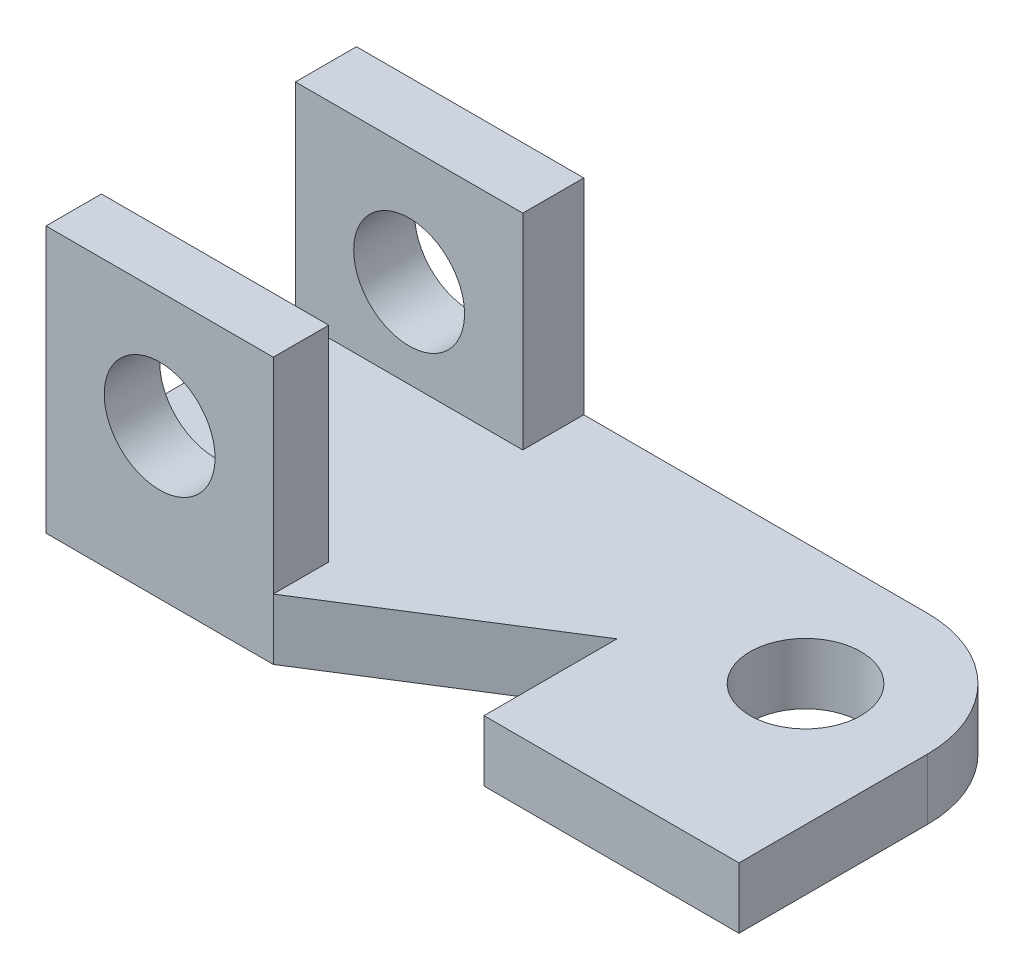
ISO-10303-21;
HEADER;
FILE_DESCRIPTION(('STEP AP214'),'2;1');
FILE_NAME('part.step','',(''),(''),'','','');
FILE_SCHEMA(('AUTOMOTIVE_DESIGN { 1 0 10303 214 1 1 1 1 }'));
ENDSEC;
DATA;
#1=APPLICATION_CONTEXT('core data for automotive mechanical design processes');
#2=APPLICATION_PROTOCOL_DEFINITION('international standard','automotive_design',2000,#1);
#3=PRODUCT_CONTEXT('',#1,'mechanical');
#4=PRODUCT('Part','Part','',(#3));
#5=PRODUCT_RELATED_PRODUCT_CATEGORY('part','',(#4));
#6=PRODUCT_DEFINITION_FORMATION('','',#4);
#7=PRODUCT_DEFINITION_CONTEXT('part definition',#1,'design');
#8=PRODUCT_DEFINITION('design','',#6,#7);
#9=PRODUCT_DEFINITION_SHAPE('','',#8);
#10=(LENGTH_UNIT() NAMED_UNIT(*) SI_UNIT(.MILLI.,.METRE.));
#11=(NAMED_UNIT(*) PLANE_ANGLE_UNIT() SI_UNIT($,.RADIAN.));
#12=(NAMED_UNIT(*) SI_UNIT($,.STERADIAN.) SOLID_ANGLE_UNIT());
#13=UNCERTAINTY_MEASURE_WITH_UNIT(LENGTH_MEASURE(1.E-05),#10,'distance_accuracy_value','');
#14=(GEOMETRIC_REPRESENTATION_CONTEXT(3) GLOBAL_UNCERTAINTY_ASSIGNED_CONTEXT((#13)) GLOBAL_UNIT_ASSIGNED_CONTEXT((#10,
#11,#12)) REPRESENTATION_CONTEXT('',''));
#15=CARTESIAN_POINT('',(0.,0.,0.));
#16=DIRECTION('',(0.,0.,1.));
#17=DIRECTION('',(1.,0.,0.));
#18=AXIS2_PLACEMENT_3D('',#15,#16,#17);
#19=CARTESIAN_POINT('',(-22.,11.,-34.));
#20=DIRECTION('',(0.,-1.,0.));
#21=DIRECTION('',(0.,0.,-1.));
#22=AXIS2_PLACEMENT_3D('',#19,#20,#21);
#23=PLANE('',#22);
#24=CARTESIAN_POINT('',(-22.,11.,-34.));
#25=DIRECTION('',(0.,1.,0.));
#26=DIRECTION('',(0.,0.,1.));
#27=AXIS2_PLACEMENT_3D('',#24,#25,#26);
#28=CIRCLE('',#27,10.);
#29=CARTESIAN_POINT('',(-22.,11.,-24.));
#30=VERTEX_POINT('',#29);
#31=EDGE_CURVE('E199',#30,#30,#28,.T.);
#32=ORIENTED_EDGE('',*,*,#31,.F.);
#33=EDGE_LOOP('',(#32));
#34=FACE_BOUND('',#33,.T.);
#35=DIRECTION('',(-1.,0.,0.));
#36=VECTOR('',#35,1.);
#37=CARTESIAN_POINT('',(-125.,11.,-56.));
#38=LINE('',#37,#36);
#39=CARTESIAN_POINT('',(-22.,11.,-56.));
#40=VERTEX_POINT('',#39);
#41=CARTESIAN_POINT('',(-84.,11.,-56.));
#42=VERTEX_POINT('',#41);
#43=EDGE_CURVE('E60',#40,#42,#38,.T.);
#44=ORIENTED_EDGE('',*,*,#43,.T.);
#45=DIRECTION('',(0.,0.,-1.));
#46=VECTOR('',#45,1.);
#47=CARTESIAN_POINT('',(-84.,11.,-45.));
#48=LINE('',#47,#46);
#49=CARTESIAN_POINT('',(-84.,11.,-45.));
#50=VERTEX_POINT('',#49);
#51=EDGE_CURVE('E55',#50,#42,#48,.T.);
#52=ORIENTED_EDGE('',*,*,#51,.F.);
#53=DIRECTION('',(-1.,0.,0.));
#54=VECTOR('',#53,1.);
#55=CARTESIAN_POINT('',(-84.,11.,-45.));
#56=LINE('',#55,#54);
#57=CARTESIAN_POINT('',(-125.,11.,-45.));
#58=VERTEX_POINT('',#57);
#59=EDGE_CURVE('E149',#50,#58,#56,.T.);
#60=ORIENTED_EDGE('',*,*,#59,.T.);
#61=DIRECTION('',(0.,0.,1.));
#62=VECTOR('',#61,1.);
#63=CARTESIAN_POINT('',(-125.,11.,0.));
#64=LINE('',#63,#62);
#65=CARTESIAN_POINT('',(-125.,11.,-9.99999999999999));
#66=VERTEX_POINT('',#65);
#67=EDGE_CURVE('E137',#58,#66,#64,.T.);
#68=ORIENTED_EDGE('',*,*,#67,.T.);
#69=DIRECTION('',(-1.,0.,0.));
#70=VECTOR('',#69,1.);
#71=CARTESIAN_POINT('',(-84.,11.,-10.));
#72=LINE('',#71,#70);
#73=CARTESIAN_POINT('',(-84.,11.,-10.));
#74=VERTEX_POINT('',#73);
#75=EDGE_CURVE('E181',#74,#66,#72,.T.);
#76=ORIENTED_EDGE('',*,*,#75,.F.);
#77=DIRECTION('',(0.,0.,-1.));
#78=VECTOR('',#77,1.);
#79=CARTESIAN_POINT('',(-84.,11.,0.));
#80=LINE('',#79,#78);
#81=CARTESIAN_POINT('',(-84.,11.,0.));
#82=VERTEX_POINT('',#81);
#83=EDGE_CURVE('E187',#82,#74,#80,.T.);
#84=ORIENTED_EDGE('',*,*,#83,.F.);
#85=DIRECTION('',(0.845488903030971,0.,-0.533992991387982));
#86=VECTOR('',#85,1.);
#87=CARTESIAN_POINT('',(-46.,11.,-24.));
#88=LINE('',#87,#86);
#89=CARTESIAN_POINT('',(-46.,11.,-24.));
#90=VERTEX_POINT('',#89);
#91=EDGE_CURVE('E147',#82,#90,#88,.T.);
#92=ORIENTED_EDGE('',*,*,#91,.T.);
#93=DIRECTION('',(0.,0.,1.));
#94=VECTOR('',#93,1.);
#95=CARTESIAN_POINT('',(-46.,11.,0.));
#96=LINE('',#95,#94);
#97=CARTESIAN_POINT('',(-46.,11.,0.));
#98=VERTEX_POINT('',#97);
#99=EDGE_CURVE('E213',#90,#98,#96,.T.);
#100=ORIENTED_EDGE('',*,*,#99,.T.);
#101=DIRECTION('',(1.,0.,0.));
#102=VECTOR('',#101,1.);
#103=CARTESIAN_POINT('',(0.,11.,0.));
#104=LINE('',#103,#102);
#105=CARTESIAN_POINT('',(0.,11.,0.));
#106=VERTEX_POINT('',#105);
#107=EDGE_CURVE('E215',#98,#106,#104,.T.);
#108=ORIENTED_EDGE('',*,*,#107,.T.);
#109=DIRECTION('',(0.,0.,-1.));
#110=VECTOR('',#109,1.);
#111=CARTESIAN_POINT('',(0.,11.,-34.));
#112=LINE('',#111,#110);
#113=CARTESIAN_POINT('',(0.,11.,-34.));
#114=VERTEX_POINT('',#113);
#115=EDGE_CURVE('E205',#106,#114,#112,.T.);
#116=ORIENTED_EDGE('',*,*,#115,.T.);
#117=CARTESIAN_POINT('',(-22.,11.,-34.));
#118=DIRECTION('',(0.,1.,0.));
#119=DIRECTION('',(0.,0.,-1.));
#120=AXIS2_PLACEMENT_3D('',#117,#118,#119);
#121=CIRCLE('',#120,22.);
#122=EDGE_CURVE('E208',#114,#40,#121,.T.);
#123=ORIENTED_EDGE('',*,*,#122,.T.);
#124=EDGE_LOOP('',(#44,#52,#60,#68,#76,#84,#92,#100,#108,#116,#123));
#125=FACE_BOUND('',#124,.T.);
#126=ADVANCED_FACE('F39',(#34,#125),#23,.F.);
#127=CARTESIAN_POINT('',(-22.,0.,-34.));
#128=DIRECTION('',(0.,-1.,0.));
#129=DIRECTION('',(0.,0.,-1.));
#130=AXIS2_PLACEMENT_3D('',#127,#128,#129);
#131=PLANE('',#130);
#132=DIRECTION('',(0.,0.,-1.));
#133=VECTOR('',#132,1.);
#134=CARTESIAN_POINT('',(0.,0.,-34.));
#135=LINE('',#134,#133);
#136=CARTESIAN_POINT('',(0.,0.,0.));
#137=VERTEX_POINT('',#136);
#138=CARTESIAN_POINT('',(0.,0.,-34.));
#139=VERTEX_POINT('',#138);
#140=EDGE_CURVE('E202',#137,#139,#135,.T.);
#141=ORIENTED_EDGE('',*,*,#140,.F.);
#142=DIRECTION('',(1.,0.,0.));
#143=VECTOR('',#142,1.);
#144=CARTESIAN_POINT('',(0.,0.,0.));
#145=LINE('',#144,#143);
#146=CARTESIAN_POINT('',(-46.,0.,0.));
#147=VERTEX_POINT('',#146);
#148=EDGE_CURVE('E209',#147,#137,#145,.T.);
#149=ORIENTED_EDGE('',*,*,#148,.F.);
#150=DIRECTION('',(0.,0.,1.));
#151=VECTOR('',#150,1.);
#152=CARTESIAN_POINT('',(-46.,0.,0.));
#153=LINE('',#152,#151);
#154=CARTESIAN_POINT('',(-46.,0.,-24.));
#155=VERTEX_POINT('',#154);
#156=EDGE_CURVE('E230',#155,#147,#153,.T.);
#157=ORIENTED_EDGE('',*,*,#156,.F.);
#158=DIRECTION('',(0.845488903030971,0.,-0.533992991387982));
#159=VECTOR('',#158,1.);
#160=CARTESIAN_POINT('',(-46.,0.,-24.));
#161=LINE('',#160,#159);
#162=CARTESIAN_POINT('',(-84.,0.,0.));
#163=VERTEX_POINT('',#162);
#164=EDGE_CURVE('E228',#163,#155,#161,.T.);
#165=ORIENTED_EDGE('',*,*,#164,.F.);
#166=DIRECTION('',(1.,0.,0.));
#167=VECTOR('',#166,1.);
#168=CARTESIAN_POINT('',(-84.,0.,0.));
#169=LINE('',#168,#167);
#170=CARTESIAN_POINT('',(-125.,0.,0.));
#171=VERTEX_POINT('',#170);
#172=EDGE_CURVE('E226',#171,#163,#169,.T.);
#173=ORIENTED_EDGE('',*,*,#172,.F.);
#174=DIRECTION('',(0.,0.,1.));
#175=VECTOR('',#174,1.);
#176=CARTESIAN_POINT('',(-125.,0.,0.));
#177=LINE('',#176,#175);
#178=CARTESIAN_POINT('',(-125.,0.,-56.));
#179=VERTEX_POINT('',#178);
#180=EDGE_CURVE('E224',#179,#171,#177,.T.);
#181=ORIENTED_EDGE('',*,*,#180,.F.);
#182=DIRECTION('',(-1.,0.,0.));
#183=VECTOR('',#182,1.);
#184=CARTESIAN_POINT('',(-125.,0.,-56.));
#185=LINE('',#184,#183);
#186=CARTESIAN_POINT('',(-22.,0.,-56.));
#187=VERTEX_POINT('',#186);
#188=EDGE_CURVE('E222',#187,#179,#185,.T.);
#189=ORIENTED_EDGE('',*,*,#188,.F.);
#190=CARTESIAN_POINT('',(-22.,0.,-34.));
#191=DIRECTION('',(0.,1.,0.));
#192=DIRECTION('',(0.,0.,-1.));
#193=AXIS2_PLACEMENT_3D('',#190,#191,#192);
#194=CIRCLE('',#193,22.);
#195=EDGE_CURVE('E220',#139,#187,#194,.T.);
#196=ORIENTED_EDGE('',*,*,#195,.F.);
#197=EDGE_LOOP('',(#141,#149,#157,#165,#173,#181,#189,#196));
#198=FACE_BOUND('',#197,.T.);
#199=CARTESIAN_POINT('',(-22.,0.,-34.));
#200=DIRECTION('',(0.,1.,0.));
#201=DIRECTION('',(0.,0.,1.));
#202=AXIS2_PLACEMENT_3D('',#199,#200,#201);
#203=CIRCLE('',#202,10.);
#204=CARTESIAN_POINT('',(-22.,0.,-24.));
#205=VERTEX_POINT('',#204);
#206=EDGE_CURVE('E198',#205,#205,#203,.T.);
#207=ORIENTED_EDGE('',*,*,#206,.T.);
#208=EDGE_LOOP('',(#207));
#209=FACE_BOUND('',#208,.T.);
#210=ADVANCED_FACE('F260',(#198,#209),#131,.T.);
#211=CARTESIAN_POINT('',(0.,11.,-34.));
#212=DIRECTION('',(-1.,0.,0.));
#213=DIRECTION('',(0.,0.,1.));
#214=AXIS2_PLACEMENT_3D('',#211,#212,#213);
#215=PLANE('',#214);
#216=ORIENTED_EDGE('',*,*,#140,.T.);
#217=DIRECTION('',(0.,-1.,0.));
#218=VECTOR('',#217,1.);
#219=CARTESIAN_POINT('',(0.,11.,-34.));
#220=LINE('',#219,#218);
#221=EDGE_CURVE('E11',#114,#139,#220,.T.);
#222=ORIENTED_EDGE('',*,*,#221,.F.);
#223=ORIENTED_EDGE('',*,*,#115,.F.);
#224=DIRECTION('',(0.,-1.,0.));
#225=VECTOR('',#224,1.);
#226=CARTESIAN_POINT('',(0.,11.,0.));
#227=LINE('',#226,#225);
#228=EDGE_CURVE('E217',#106,#137,#227,.T.);
#229=ORIENTED_EDGE('',*,*,#228,.T.);
#230=EDGE_LOOP('',(#216,#222,#223,#229));
#231=FACE_BOUND('',#230,.T.);
#232=ADVANCED_FACE('F41',(#231),#215,.F.);
#233=CARTESIAN_POINT('',(-22.,11.,-34.));
#234=DIRECTION('',(0.,-1.,0.));
#235=DIRECTION('',(0.,0.,-1.));
#236=AXIS2_PLACEMENT_3D('',#233,#234,#235);
#237=CYLINDRICAL_SURFACE('',#236,22.);
#238=ORIENTED_EDGE('',*,*,#195,.T.);
#239=DIRECTION('',(0.,-1.,0.));
#240=VECTOR('',#239,1.);
#241=CARTESIAN_POINT('',(-22.,11.,-56.));
#242=LINE('',#241,#240);
#243=EDGE_CURVE('E48',#40,#187,#242,.T.);
#244=ORIENTED_EDGE('',*,*,#243,.F.);
#245=ORIENTED_EDGE('',*,*,#122,.F.);
#246=ORIENTED_EDGE('',*,*,#221,.T.);
#247=EDGE_LOOP('',(#238,#244,#245,#246));
#248=FACE_BOUND('',#247,.T.);
#249=ADVANCED_FACE('F318',(#248),#237,.T.);
#250=CARTESIAN_POINT('',(-125.,11.,-56.));
#251=DIRECTION('',(0.,0.,1.));
#252=DIRECTION('',(1.,0.,0.));
#253=AXIS2_PLACEMENT_3D('',#250,#251,#252);
#254=PLANE('',#253);
#255=ORIENTED_EDGE('',*,*,#188,.T.);
#256=DIRECTION('',(0.,-1.,0.));
#257=VECTOR('',#256,1.);
#258=CARTESIAN_POINT('',(-125.,11.,-56.));
#259=LINE('',#258,#257);
#260=CARTESIAN_POINT('',(-125.,48.,-56.));
#261=VERTEX_POINT('',#260);
#262=EDGE_CURVE('E247',#261,#179,#259,.T.);
#263=ORIENTED_EDGE('',*,*,#262,.F.);
#264=DIRECTION('',(1.,0.,0.));
#265=VECTOR('',#264,1.);
#266=CARTESIAN_POINT('',(-125.,48.,-56.));
#267=LINE('',#266,#265);
#268=CARTESIAN_POINT('',(-84.,48.,-56.));
#269=VERTEX_POINT('',#268);
#270=EDGE_CURVE('E165',#261,#269,#267,.T.);
#271=ORIENTED_EDGE('',*,*,#270,.T.);
#272=DIRECTION('',(0.,-1.,0.));
#273=VECTOR('',#272,1.);
#274=CARTESIAN_POINT('',(-84.,48.,-56.));
#275=LINE('',#274,#273);
#276=EDGE_CURVE('E162',#269,#42,#275,.T.);
#277=ORIENTED_EDGE('',*,*,#276,.T.);
#278=ORIENTED_EDGE('',*,*,#43,.F.);
#279=ORIENTED_EDGE('',*,*,#243,.T.);
#280=EDGE_LOOP('',(#255,#263,#271,#277,#278,#279));
#281=FACE_BOUND('',#280,.T.);
#282=CARTESIAN_POINT('',(-104.5,27.,-56.));
#283=DIRECTION('',(0.,0.,-1.));
#284=DIRECTION('',(-1.,0.,0.));
#285=AXIS2_PLACEMENT_3D('',#282,#283,#284);
#286=CIRCLE('',#285,9.99999999999999);
#287=CARTESIAN_POINT('',(-114.5,27.,-56.));
#288=VERTEX_POINT('',#287);
#289=EDGE_CURVE('E474',#288,#288,#286,.T.);
#290=ORIENTED_EDGE('',*,*,#289,.F.);
#291=EDGE_LOOP('',(#290));
#292=FACE_BOUND('',#291,.T.);
#293=ADVANCED_FACE('F254',(#281,#292),#254,.F.);
#294=CARTESIAN_POINT('',(-125.,11.,0.));
#295=DIRECTION('',(1.,0.,0.));
#296=DIRECTION('',(0.,0.,-1.));
#297=AXIS2_PLACEMENT_3D('',#294,#295,#296);
#298=PLANE('',#297);
#299=ORIENTED_EDGE('',*,*,#180,.T.);
#300=DIRECTION('',(0.,-1.,0.));
#301=VECTOR('',#300,1.);
#302=CARTESIAN_POINT('',(-125.,11.,0.));
#303=LINE('',#302,#301);
#304=CARTESIAN_POINT('',(-125.,48.,0.));
#305=VERTEX_POINT('',#304);
#306=EDGE_CURVE('E244',#305,#171,#303,.T.);
#307=ORIENTED_EDGE('',*,*,#306,.F.);
#308=DIRECTION('',(0.,0.,1.));
#309=VECTOR('',#308,1.);
#310=CARTESIAN_POINT('',(-125.,48.,-9.99999999999999));
#311=LINE('',#310,#309);
#312=CARTESIAN_POINT('',(-125.,48.,-9.99999999999999));
#313=VERTEX_POINT('',#312);
#314=EDGE_CURVE('E177',#313,#305,#311,.T.);
#315=ORIENTED_EDGE('',*,*,#314,.F.);
#316=DIRECTION('',(0.,-1.,0.));
#317=VECTOR('',#316,1.);
#318=CARTESIAN_POINT('',(-125.,48.,-9.99999999999999));
#319=LINE('',#318,#317);
#320=EDGE_CURVE('E145',#313,#66,#319,.T.);
#321=ORIENTED_EDGE('',*,*,#320,.T.);
#322=ORIENTED_EDGE('',*,*,#67,.F.);
#323=DIRECTION('',(0.,1.,0.));
#324=VECTOR('',#323,1.);
#325=CARTESIAN_POINT('',(-125.,11.,-45.));
#326=LINE('',#325,#324);
#327=CARTESIAN_POINT('',(-125.,48.,-45.));
#328=VERTEX_POINT('',#327);
#329=EDGE_CURVE('E141',#58,#328,#326,.T.);
#330=ORIENTED_EDGE('',*,*,#329,.T.);
#331=DIRECTION('',(0.,0.,-1.));
#332=VECTOR('',#331,1.);
#333=CARTESIAN_POINT('',(-125.,48.,-45.));
#334=LINE('',#333,#332);
#335=EDGE_CURVE('E172',#328,#261,#334,.T.);
#336=ORIENTED_EDGE('',*,*,#335,.T.);
#337=ORIENTED_EDGE('',*,*,#262,.T.);
#338=EDGE_LOOP('',(#299,#307,#315,#321,#322,#330,#336,#337));
#339=FACE_BOUND('',#338,.T.);
#340=ADVANCED_FACE('F138',(#339),#298,.F.);
#341=CARTESIAN_POINT('',(-84.,11.,0.));
#342=DIRECTION('',(0.,0.,-1.));
#343=DIRECTION('',(-1.,0.,0.));
#344=AXIS2_PLACEMENT_3D('',#341,#342,#343);
#345=PLANE('',#344);
#346=CARTESIAN_POINT('',(-104.5,27.,0.));
#347=DIRECTION('',(0.,0.,1.));
#348=DIRECTION('',(1.,0.,0.));
#349=AXIS2_PLACEMENT_3D('',#346,#347,#348);
#350=CIRCLE('',#349,9.99999999999999);
#351=CARTESIAN_POINT('',(-94.5,27.,0.));
#352=VERTEX_POINT('',#351);
#353=EDGE_CURVE('E171',#352,#352,#350,.T.);
#354=ORIENTED_EDGE('',*,*,#353,.F.);
#355=EDGE_LOOP('',(#354));
#356=FACE_BOUND('',#355,.T.);
#357=ORIENTED_EDGE('',*,*,#172,.T.);
#358=DIRECTION('',(0.,-1.,0.));
#359=VECTOR('',#358,1.);
#360=CARTESIAN_POINT('',(-84.,11.,0.));
#361=LINE('',#360,#359);
#362=EDGE_CURVE('E241',#82,#163,#361,.T.);
#363=ORIENTED_EDGE('',*,*,#362,.F.);
#364=DIRECTION('',(0.,-1.,0.));
#365=VECTOR('',#364,1.);
#366=CARTESIAN_POINT('',(-84.,48.,0.));
#367=LINE('',#366,#365);
#368=CARTESIAN_POINT('',(-84.,48.,0.));
#369=VERTEX_POINT('',#368);
#370=EDGE_CURVE('E195',#369,#82,#367,.T.);
#371=ORIENTED_EDGE('',*,*,#370,.F.);
#372=DIRECTION('',(1.,0.,0.));
#373=VECTOR('',#372,1.);
#374=CARTESIAN_POINT('',(-125.,48.,0.));
#375=LINE('',#374,#373);
#376=EDGE_CURVE('E180',#305,#369,#375,.T.);
#377=ORIENTED_EDGE('',*,*,#376,.F.);
#378=ORIENTED_EDGE('',*,*,#306,.T.);
#379=EDGE_LOOP('',(#357,#363,#371,#377,#378));
#380=FACE_BOUND('',#379,.T.);
#381=ADVANCED_FACE('F266',(#356,#380),#345,.F.);
#382=CARTESIAN_POINT('',(-46.,11.,-24.));
#383=DIRECTION('',(-0.533992991387982,0.,-0.845488903030971));
#384=DIRECTION('',(-0.845488903030971,0.,0.533992991387982));
#385=AXIS2_PLACEMENT_3D('',#382,#383,#384);
#386=PLANE('',#385);
#387=ORIENTED_EDGE('',*,*,#164,.T.);
#388=DIRECTION('',(0.,-1.,0.));
#389=VECTOR('',#388,1.);
#390=CARTESIAN_POINT('',(-46.,11.,-24.));
#391=LINE('',#390,#389);
#392=EDGE_CURVE('E238',#90,#155,#391,.T.);
#393=ORIENTED_EDGE('',*,*,#392,.F.);
#394=ORIENTED_EDGE('',*,*,#91,.F.);
#395=ORIENTED_EDGE('',*,*,#362,.T.);
#396=EDGE_LOOP('',(#387,#393,#394,#395));
#397=FACE_BOUND('',#396,.T.);
#398=ADVANCED_FACE('F309',(#397),#386,.F.);
#399=CARTESIAN_POINT('',(-46.,11.,0.));
#400=DIRECTION('',(1.,0.,0.));
#401=DIRECTION('',(0.,0.,-1.));
#402=AXIS2_PLACEMENT_3D('',#399,#400,#401);
#403=PLANE('',#402);
#404=ORIENTED_EDGE('',*,*,#156,.T.);
#405=DIRECTION('',(0.,-1.,0.));
#406=VECTOR('',#405,1.);
#407=CARTESIAN_POINT('',(-46.,11.,0.));
#408=LINE('',#407,#406);
#409=EDGE_CURVE('E235',#98,#147,#408,.T.);
#410=ORIENTED_EDGE('',*,*,#409,.F.);
#411=ORIENTED_EDGE('',*,*,#99,.F.);
#412=ORIENTED_EDGE('',*,*,#392,.T.);
#413=EDGE_LOOP('',(#404,#410,#411,#412));
#414=FACE_BOUND('',#413,.T.);
#415=ADVANCED_FACE('F305',(#414),#403,.F.);
#416=CARTESIAN_POINT('',(0.,11.,0.));
#417=DIRECTION('',(0.,0.,-1.));
#418=DIRECTION('',(-1.,0.,0.));
#419=AXIS2_PLACEMENT_3D('',#416,#417,#418);
#420=PLANE('',#419);
#421=ORIENTED_EDGE('',*,*,#148,.T.);
#422=ORIENTED_EDGE('',*,*,#228,.F.);
#423=ORIENTED_EDGE('',*,*,#107,.F.);
#424=ORIENTED_EDGE('',*,*,#409,.T.);
#425=EDGE_LOOP('',(#421,#422,#423,#424));
#426=FACE_BOUND('',#425,.T.);
#427=ADVANCED_FACE('F289',(#426),#420,.F.);
#428=CARTESIAN_POINT('',(-22.,11.,-34.));
#429=DIRECTION('',(0.,-1.,0.));
#430=DIRECTION('',(0.,0.,-1.));
#431=AXIS2_PLACEMENT_3D('',#428,#429,#430);
#432=CYLINDRICAL_SURFACE('',#431,10.);
#433=ORIENTED_EDGE('',*,*,#31,.T.);
#434=EDGE_LOOP('',(#433));
#435=FACE_BOUND('',#434,.T.);
#436=ORIENTED_EDGE('',*,*,#206,.F.);
#437=EDGE_LOOP('',(#436));
#438=FACE_BOUND('',#437,.T.);
#439=ADVANCED_FACE('F279',(#435,#438),#432,.F.);
#440=CARTESIAN_POINT('',(-84.,48.,0.));
#441=DIRECTION('',(-1.,0.,0.));
#442=DIRECTION('',(0.,0.,1.));
#443=AXIS2_PLACEMENT_3D('',#440,#441,#442);
#444=PLANE('',#443);
#445=ORIENTED_EDGE('',*,*,#83,.T.);
#446=DIRECTION('',(0.,-1.,0.));
#447=VECTOR('',#446,1.);
#448=CARTESIAN_POINT('',(-84.,48.,-10.));
#449=LINE('',#448,#447);
#450=CARTESIAN_POINT('',(-84.,48.,-10.));
#451=VERTEX_POINT('',#450);
#452=EDGE_CURVE('E192',#451,#74,#449,.T.);
#453=ORIENTED_EDGE('',*,*,#452,.F.);
#454=DIRECTION('',(0.,0.,-1.));
#455=VECTOR('',#454,1.);
#456=CARTESIAN_POINT('',(-84.,48.,0.));
#457=LINE('',#456,#455);
#458=EDGE_CURVE('E183',#369,#451,#457,.T.);
#459=ORIENTED_EDGE('',*,*,#458,.F.);
#460=ORIENTED_EDGE('',*,*,#370,.T.);
#461=EDGE_LOOP('',(#445,#453,#459,#460));
#462=FACE_BOUND('',#461,.T.);
#463=ADVANCED_FACE('F277',(#462),#444,.F.);
#464=CARTESIAN_POINT('',(-84.,48.,-10.));
#465=DIRECTION('',(0.,0.,1.));
#466=DIRECTION('',(1.,0.,0.));
#467=AXIS2_PLACEMENT_3D('',#464,#465,#466);
#468=PLANE('',#467);
#469=CARTESIAN_POINT('',(-104.5,27.,-9.99999999999999));
#470=DIRECTION('',(0.,0.,1.));
#471=DIRECTION('',(1.,0.,0.));
#472=AXIS2_PLACEMENT_3D('',#469,#470,#471);
#473=CIRCLE('',#472,9.99999999999999);
#474=CARTESIAN_POINT('',(-94.5,27.,-10.));
#475=VERTEX_POINT('',#474);
#476=EDGE_CURVE('E43',#475,#475,#473,.T.);
#477=ORIENTED_EDGE('',*,*,#476,.T.);
#478=EDGE_LOOP('',(#477));
#479=FACE_BOUND('',#478,.T.);
#480=ORIENTED_EDGE('',*,*,#75,.T.);
#481=ORIENTED_EDGE('',*,*,#320,.F.);
#482=DIRECTION('',(-1.,0.,0.));
#483=VECTOR('',#482,1.);
#484=CARTESIAN_POINT('',(-84.,48.,-10.));
#485=LINE('',#484,#483);
#486=EDGE_CURVE('E185',#451,#313,#485,.T.);
#487=ORIENTED_EDGE('',*,*,#486,.F.);
#488=ORIENTED_EDGE('',*,*,#452,.T.);
#489=EDGE_LOOP('',(#480,#481,#487,#488));
#490=FACE_BOUND('',#489,.T.);
#491=ADVANCED_FACE('F275',(#479,#490),#468,.F.);
#492=CARTESIAN_POINT('',(0.,48.,0.));
#493=DIRECTION('',(0.,1.,0.));
#494=DIRECTION('',(0.,0.,1.));
#495=AXIS2_PLACEMENT_3D('',#492,#493,#494);
#496=PLANE('',#495);
#497=ORIENTED_EDGE('',*,*,#314,.T.);
#498=ORIENTED_EDGE('',*,*,#376,.T.);
#499=ORIENTED_EDGE('',*,*,#458,.T.);
#500=ORIENTED_EDGE('',*,*,#486,.T.);
#501=EDGE_LOOP('',(#497,#498,#499,#500));
#502=FACE_BOUND('',#501,.T.);
#503=ADVANCED_FACE('F271',(#502),#496,.T.);
#504=CARTESIAN_POINT('',(-104.5,27.,-37.));
#505=DIRECTION('',(0.,0.,1.));
#506=DIRECTION('',(1.,0.,0.));
#507=AXIS2_PLACEMENT_3D('',#504,#505,#506);
#508=CYLINDRICAL_SURFACE('',#507,9.99999999999999);
#509=ORIENTED_EDGE('',*,*,#353,.T.);
#510=EDGE_LOOP('',(#509));
#511=FACE_BOUND('',#510,.T.);
#512=ORIENTED_EDGE('',*,*,#476,.F.);
#513=EDGE_LOOP('',(#512));
#514=FACE_BOUND('',#513,.T.);
#515=ADVANCED_FACE('F405',(#511,#514),#508,.F.);
#516=CARTESIAN_POINT('',(-84.,48.,-45.));
#517=DIRECTION('',(1.,0.,0.));
#518=DIRECTION('',(0.,0.,-1.));
#519=AXIS2_PLACEMENT_3D('',#516,#517,#518);
#520=PLANE('',#519);
#521=ORIENTED_EDGE('',*,*,#276,.F.);
#522=DIRECTION('',(0.,0.,-1.));
#523=VECTOR('',#522,1.);
#524=CARTESIAN_POINT('',(-84.,48.,-45.));
#525=LINE('',#524,#523);
#526=CARTESIAN_POINT('',(-84.,48.,-45.));
#527=VERTEX_POINT('',#526);
#528=EDGE_CURVE('E169',#527,#269,#525,.T.);
#529=ORIENTED_EDGE('',*,*,#528,.F.);
#530=DIRECTION('',(0.,-1.,0.));
#531=VECTOR('',#530,1.);
#532=CARTESIAN_POINT('',(-84.,48.,-45.));
#533=LINE('',#532,#531);
#534=EDGE_CURVE('E153',#527,#50,#533,.T.);
#535=ORIENTED_EDGE('',*,*,#534,.T.);
#536=ORIENTED_EDGE('',*,*,#51,.T.);
#537=EDGE_LOOP('',(#521,#529,#535,#536));
#538=FACE_BOUND('',#537,.T.);
#539=ADVANCED_FACE('F412',(#538),#520,.T.);
#540=CARTESIAN_POINT('',(-125.,48.,-45.));
#541=DIRECTION('',(0.,1.,0.));
#542=DIRECTION('',(0.,0.,1.));
#543=AXIS2_PLACEMENT_3D('',#540,#541,#542);
#544=PLANE('',#543);
#545=ORIENTED_EDGE('',*,*,#270,.F.);
#546=ORIENTED_EDGE('',*,*,#335,.F.);
#547=DIRECTION('',(1.,0.,0.));
#548=VECTOR('',#547,1.);
#549=CARTESIAN_POINT('',(-125.,48.,-45.));
#550=LINE('',#549,#548);
#551=EDGE_CURVE('E157',#328,#527,#550,.T.);
#552=ORIENTED_EDGE('',*,*,#551,.T.);
#553=ORIENTED_EDGE('',*,*,#528,.T.);
#554=EDGE_LOOP('',(#545,#546,#552,#553));
#555=FACE_BOUND('',#554,.T.);
#556=ADVANCED_FACE('F421',(#555),#544,.T.);
#557=CARTESIAN_POINT('',(0.,0.,-45.));
#558=DIRECTION('',(0.,0.,-1.));
#559=DIRECTION('',(-1.,0.,0.));
#560=AXIS2_PLACEMENT_3D('',#557,#558,#559);
#561=PLANE('',#560);
#562=CARTESIAN_POINT('',(-104.5,27.,-45.));
#563=DIRECTION('',(0.,0.,-1.));
#564=DIRECTION('',(-1.,0.,0.));
#565=AXIS2_PLACEMENT_3D('',#562,#563,#564);
#566=CIRCLE('',#565,9.99999999999999);
#567=CARTESIAN_POINT('',(-114.5,27.,-45.));
#568=VERTEX_POINT('',#567);
#569=EDGE_CURVE('E166',#568,#568,#566,.T.);
#570=ORIENTED_EDGE('',*,*,#569,.T.);
#571=EDGE_LOOP('',(#570));
#572=FACE_BOUND('',#571,.T.);
#573=ORIENTED_EDGE('',*,*,#534,.F.);
#574=ORIENTED_EDGE('',*,*,#551,.F.);
#575=ORIENTED_EDGE('',*,*,#329,.F.);
#576=ORIENTED_EDGE('',*,*,#59,.F.);
#577=EDGE_LOOP('',(#573,#574,#575,#576));
#578=FACE_BOUND('',#577,.T.);
#579=ADVANCED_FACE('F155',(#572,#578),#561,.F.);
#580=CARTESIAN_POINT('',(-104.5,27.,-45.));
#581=DIRECTION('',(0.,0.,-1.));
#582=DIRECTION('',(-1.,0.,0.));
#583=AXIS2_PLACEMENT_3D('',#580,#581,#582);
#584=CYLINDRICAL_SURFACE('',#583,9.99999999999999);
#585=ORIENTED_EDGE('',*,*,#569,.F.);
#586=EDGE_LOOP('',(#585));
#587=FACE_BOUND('',#586,.T.);
#588=ORIENTED_EDGE('',*,*,#289,.T.);
#589=EDGE_LOOP('',(#588));
#590=FACE_BOUND('',#589,.T.);
#591=ADVANCED_FACE('F439',(#587,#590),#584,.F.);
#592=CLOSED_SHELL('',(#126,#210,#232,#249,#293,#340,#381,#398,#415,#427,#439,#463,#491,#503,
#515,#539,#556,#579,#591));
#593=MANIFOLD_SOLID_BREP('B2',#592);
#594=ADVANCED_BREP_SHAPE_REPRESENTATION('',(#18,#593),#14);
#595=SHAPE_DEFINITION_REPRESENTATION(#9,#594);
ENDSEC;
END-ISO-10303-21;
